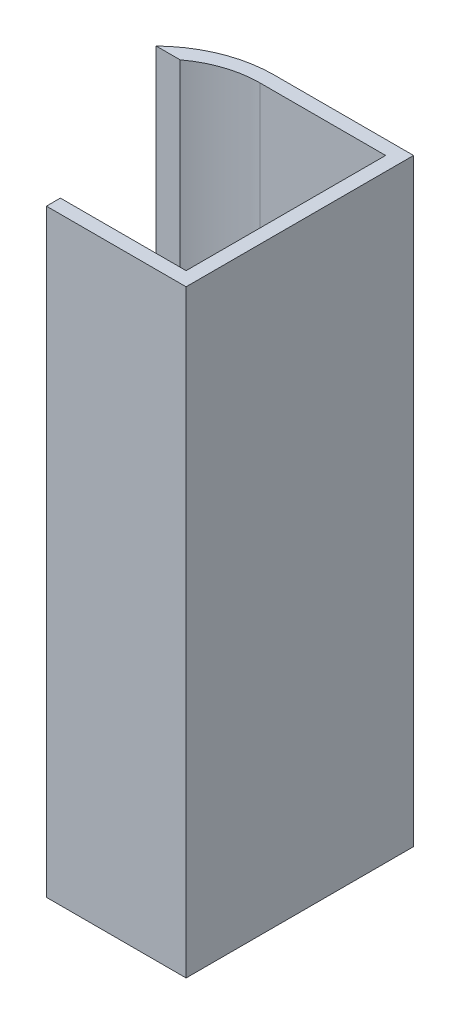
ISO-10303-21;
HEADER;
FILE_DESCRIPTION(('STEP AP214'),'2;1');
FILE_NAME('part.step','',(''),(''),'','','');
FILE_SCHEMA(('AUTOMOTIVE_DESIGN { 1 0 10303 214 1 1 1 1 }'));
ENDSEC;
DATA;
#1=APPLICATION_CONTEXT('core data for automotive mechanical design processes');
#2=APPLICATION_PROTOCOL_DEFINITION('international standard','automotive_design',2000,#1);
#3=PRODUCT_CONTEXT('',#1,'mechanical');
#4=PRODUCT('Part','Part','',(#3));
#5=PRODUCT_RELATED_PRODUCT_CATEGORY('part','',(#4));
#6=PRODUCT_DEFINITION_FORMATION('','',#4);
#7=PRODUCT_DEFINITION_CONTEXT('part definition',#1,'design');
#8=PRODUCT_DEFINITION('design','',#6,#7);
#9=PRODUCT_DEFINITION_SHAPE('','',#8);
#10=(LENGTH_UNIT() NAMED_UNIT(*) SI_UNIT(.MILLI.,.METRE.));
#11=(NAMED_UNIT(*) PLANE_ANGLE_UNIT() SI_UNIT($,.RADIAN.));
#12=(NAMED_UNIT(*) SI_UNIT($,.STERADIAN.) SOLID_ANGLE_UNIT());
#13=UNCERTAINTY_MEASURE_WITH_UNIT(LENGTH_MEASURE(1.E-05),#10,'distance_accuracy_value','');
#14=(GEOMETRIC_REPRESENTATION_CONTEXT(3) GLOBAL_UNCERTAINTY_ASSIGNED_CONTEXT((#13)) GLOBAL_UNIT_ASSIGNED_CONTEXT((#10,
#11,#12)) REPRESENTATION_CONTEXT('',''));
#15=CARTESIAN_POINT('',(0.,0.,0.));
#16=DIRECTION('',(0.,0.,1.));
#17=DIRECTION('',(1.,0.,0.));
#18=AXIS2_PLACEMENT_3D('',#15,#16,#17);
#19=CARTESIAN_POINT('',(6.99999999999999,300.,-57.));
#20=DIRECTION('',(0.,0.,1.));
#21=DIRECTION('',(1.,0.,0.));
#22=AXIS2_PLACEMENT_3D('',#19,#20,#21);
#23=PLANE('',#22);
#24=DIRECTION('',(-1.,0.,0.));
#25=VECTOR('',#24,1.);
#26=CARTESIAN_POINT('',(6.99999999999999,0.,-57.));
#27=LINE('',#26,#25);
#28=CARTESIAN_POINT('',(6.99999999999999,0.,-57.));
#29=VERTEX_POINT('',#28);
#30=CARTESIAN_POINT('',(-63.,0.,-57.));
#31=VERTEX_POINT('',#30);
#32=EDGE_CURVE('E141',#29,#31,#27,.T.);
#33=ORIENTED_EDGE('',*,*,#32,.T.);
#34=DIRECTION('',(0.,-1.,0.));
#35=VECTOR('',#34,1.);
#36=CARTESIAN_POINT('',(-63.,300.,-57.));
#37=LINE('',#36,#35);
#38=CARTESIAN_POINT('',(-63.,300.,-57.));
#39=VERTEX_POINT('',#38);
#40=EDGE_CURVE('E11',#39,#31,#37,.T.);
#41=ORIENTED_EDGE('',*,*,#40,.F.);
#42=DIRECTION('',(-1.,0.,0.));
#43=VECTOR('',#42,1.);
#44=CARTESIAN_POINT('',(6.99999999999999,300.,-57.));
#45=LINE('',#44,#43);
#46=CARTESIAN_POINT('',(6.99999999999999,300.,-57.));
#47=VERTEX_POINT('',#46);
#48=EDGE_CURVE('E159',#47,#39,#45,.T.);
#49=ORIENTED_EDGE('',*,*,#48,.F.);
#50=DIRECTION('',(0.,-1.,0.));
#51=VECTOR('',#50,1.);
#52=CARTESIAN_POINT('',(6.99999999999999,300.,-57.));
#53=LINE('',#52,#51);
#54=EDGE_CURVE('E137',#47,#29,#53,.T.);
#55=ORIENTED_EDGE('',*,*,#54,.T.);
#56=EDGE_LOOP('',(#33,#41,#49,#55));
#57=FACE_BOUND('',#56,.T.);
#58=ADVANCED_FACE('F33',(#57),#23,.F.);
#59=CARTESIAN_POINT('',(-63.,300.,3.38235294117649));
#60=DIRECTION('',(0.,-1.,0.));
#61=DIRECTION('',(0.,0.,-1.));
#62=AXIS2_PLACEMENT_3D('',#59,#60,#61);
#63=CYLINDRICAL_SURFACE('',#62,60.3823529411765);
#64=CARTESIAN_POINT('',(-63.,0.,3.38235294117649));
#65=DIRECTION('',(0.,1.,0.));
#66=DIRECTION('',(0.,0.,1.));
#67=AXIS2_PLACEMENT_3D('',#64,#65,#66);
#68=CIRCLE('',#67,60.3823529411765);
#69=CARTESIAN_POINT('',(-105.,0.,-40.));
#70=VERTEX_POINT('',#69);
#71=EDGE_CURVE('E144',#31,#70,#68,.T.);
#72=ORIENTED_EDGE('',*,*,#71,.T.);
#73=DIRECTION('',(0.,-1.,0.));
#74=VECTOR('',#73,1.);
#75=CARTESIAN_POINT('',(-105.,300.,-40.));
#76=LINE('',#75,#74);
#77=CARTESIAN_POINT('',(-105.,300.,-40.));
#78=VERTEX_POINT('',#77);
#79=EDGE_CURVE('E41',#78,#70,#76,.T.);
#80=ORIENTED_EDGE('',*,*,#79,.F.);
#81=CARTESIAN_POINT('',(-63.,300.,3.38235294117649));
#82=DIRECTION('',(0.,1.,0.));
#83=DIRECTION('',(0.,0.,1.));
#84=AXIS2_PLACEMENT_3D('',#81,#82,#83);
#85=CIRCLE('',#84,60.3823529411765);
#86=EDGE_CURVE('E98',#39,#78,#85,.T.);
#87=ORIENTED_EDGE('',*,*,#86,.F.);
#88=ORIENTED_EDGE('',*,*,#40,.T.);
#89=EDGE_LOOP('',(#72,#80,#87,#88));
#90=FACE_BOUND('',#89,.T.);
#91=ADVANCED_FACE('F208',(#90),#63,.T.);
#92=CARTESIAN_POINT('',(-105.,300.,-40.));
#93=DIRECTION('',(0.,0.,-1.));
#94=DIRECTION('',(-1.,0.,0.));
#95=AXIS2_PLACEMENT_3D('',#92,#93,#94);
#96=PLANE('',#95);
#97=DIRECTION('',(1.,0.,0.));
#98=VECTOR('',#97,1.);
#99=CARTESIAN_POINT('',(-105.,0.,-40.));
#100=LINE('',#99,#98);
#101=CARTESIAN_POINT('',(-93.,0.,-40.));
#102=VERTEX_POINT('',#101);
#103=EDGE_CURVE('E146',#70,#102,#100,.T.);
#104=ORIENTED_EDGE('',*,*,#103,.T.);
#105=DIRECTION('',(0.,-1.,0.));
#106=VECTOR('',#105,1.);
#107=CARTESIAN_POINT('',(-93.,300.,-40.));
#108=LINE('',#107,#106);
#109=CARTESIAN_POINT('',(-93.,300.,-40.));
#110=VERTEX_POINT('',#109);
#111=EDGE_CURVE('E172',#110,#102,#108,.T.);
#112=ORIENTED_EDGE('',*,*,#111,.F.);
#113=DIRECTION('',(1.,0.,0.));
#114=VECTOR('',#113,1.);
#115=CARTESIAN_POINT('',(-105.,300.,-40.));
#116=LINE('',#115,#114);
#117=EDGE_CURVE('E180',#78,#110,#116,.T.);
#118=ORIENTED_EDGE('',*,*,#117,.F.);
#119=ORIENTED_EDGE('',*,*,#79,.T.);
#120=EDGE_LOOP('',(#104,#112,#118,#119));
#121=FACE_BOUND('',#120,.T.);
#122=ADVANCED_FACE('F178',(#121),#96,.F.);
#123=CARTESIAN_POINT('',(-63.,300.,0.));
#124=DIRECTION('',(0.,-1.,0.));
#125=DIRECTION('',(0.,0.,-1.));
#126=AXIS2_PLACEMENT_3D('',#123,#124,#125);
#127=CYLINDRICAL_SURFACE('',#126,50.);
#128=CARTESIAN_POINT('',(-63.,0.,0.));
#129=DIRECTION('',(0.,-1.,0.));
#130=DIRECTION('',(0.,0.,-1.));
#131=AXIS2_PLACEMENT_3D('',#128,#129,#130);
#132=CIRCLE('',#131,50.);
#133=CARTESIAN_POINT('',(-63.,0.,-50.));
#134=VERTEX_POINT('',#133);
#135=EDGE_CURVE('E148',#102,#134,#132,.T.);
#136=ORIENTED_EDGE('',*,*,#135,.T.);
#137=DIRECTION('',(0.,-1.,0.));
#138=VECTOR('',#137,1.);
#139=CARTESIAN_POINT('',(-63.,300.,-50.));
#140=LINE('',#139,#138);
#141=CARTESIAN_POINT('',(-63.,300.,-50.));
#142=VERTEX_POINT('',#141);
#143=EDGE_CURVE('E169',#142,#134,#140,.T.);
#144=ORIENTED_EDGE('',*,*,#143,.F.);
#145=CARTESIAN_POINT('',(-63.,300.,0.));
#146=DIRECTION('',(0.,-1.,0.));
#147=DIRECTION('',(0.,0.,-1.));
#148=AXIS2_PLACEMENT_3D('',#145,#146,#147);
#149=CIRCLE('',#148,50.);
#150=EDGE_CURVE('E198',#110,#142,#149,.T.);
#151=ORIENTED_EDGE('',*,*,#150,.F.);
#152=ORIENTED_EDGE('',*,*,#111,.T.);
#153=EDGE_LOOP('',(#136,#144,#151,#152));
#154=FACE_BOUND('',#153,.T.);
#155=ADVANCED_FACE('F189',(#154),#127,.F.);
#156=CARTESIAN_POINT('',(-63.,300.,-50.));
#157=DIRECTION('',(0.,0.,-1.));
#158=DIRECTION('',(-1.,0.,0.));
#159=AXIS2_PLACEMENT_3D('',#156,#157,#158);
#160=PLANE('',#159);
#161=DIRECTION('',(1.,0.,0.));
#162=VECTOR('',#161,1.);
#163=CARTESIAN_POINT('',(-63.,0.,-50.));
#164=LINE('',#163,#162);
#165=CARTESIAN_POINT('',(0.,0.,-50.));
#166=VERTEX_POINT('',#165);
#167=EDGE_CURVE('E150',#134,#166,#164,.T.);
#168=ORIENTED_EDGE('',*,*,#167,.T.);
#169=DIRECTION('',(0.,-1.,0.));
#170=VECTOR('',#169,1.);
#171=CARTESIAN_POINT('',(0.,300.,-50.));
#172=LINE('',#171,#170);
#173=CARTESIAN_POINT('',(0.,300.,-50.));
#174=VERTEX_POINT('',#173);
#175=EDGE_CURVE('E166',#174,#166,#172,.T.);
#176=ORIENTED_EDGE('',*,*,#175,.F.);
#177=DIRECTION('',(1.,0.,0.));
#178=VECTOR('',#177,1.);
#179=CARTESIAN_POINT('',(-63.,300.,-50.));
#180=LINE('',#179,#178);
#181=EDGE_CURVE('E195',#142,#174,#180,.T.);
#182=ORIENTED_EDGE('',*,*,#181,.F.);
#183=ORIENTED_EDGE('',*,*,#143,.T.);
#184=EDGE_LOOP('',(#168,#176,#182,#183));
#185=FACE_BOUND('',#184,.T.);
#186=ADVANCED_FACE('F193',(#185),#160,.F.);
#187=CARTESIAN_POINT('',(0.,300.,-50.));
#188=DIRECTION('',(1.,0.,0.));
#189=DIRECTION('',(0.,0.,-1.));
#190=AXIS2_PLACEMENT_3D('',#187,#188,#189);
#191=PLANE('',#190);
#192=DIRECTION('',(0.,0.,1.));
#193=VECTOR('',#192,1.);
#194=CARTESIAN_POINT('',(0.,0.,-50.));
#195=LINE('',#194,#193);
#196=CARTESIAN_POINT('',(0.,0.,50.));
#197=VERTEX_POINT('',#196);
#198=EDGE_CURVE('E152',#166,#197,#195,.T.);
#199=ORIENTED_EDGE('',*,*,#198,.T.);
#200=DIRECTION('',(0.,-1.,0.));
#201=VECTOR('',#200,1.);
#202=CARTESIAN_POINT('',(0.,300.,50.));
#203=LINE('',#202,#201);
#204=CARTESIAN_POINT('',(0.,300.,50.));
#205=VERTEX_POINT('',#204);
#206=EDGE_CURVE('E163',#205,#197,#203,.T.);
#207=ORIENTED_EDGE('',*,*,#206,.F.);
#208=DIRECTION('',(0.,0.,1.));
#209=VECTOR('',#208,1.);
#210=CARTESIAN_POINT('',(0.,300.,-50.));
#211=LINE('',#210,#209);
#212=EDGE_CURVE('E197',#174,#205,#211,.T.);
#213=ORIENTED_EDGE('',*,*,#212,.F.);
#214=ORIENTED_EDGE('',*,*,#175,.T.);
#215=EDGE_LOOP('',(#199,#207,#213,#214));
#216=FACE_BOUND('',#215,.T.);
#217=ADVANCED_FACE('F220',(#216),#191,.F.);
#218=CARTESIAN_POINT('',(0.,300.,50.));
#219=DIRECTION('',(0.,0.,1.));
#220=DIRECTION('',(1.,0.,0.));
#221=AXIS2_PLACEMENT_3D('',#218,#219,#220);
#222=PLANE('',#221);
#223=DIRECTION('',(-1.,0.,0.));
#224=VECTOR('',#223,1.);
#225=CARTESIAN_POINT('',(0.,0.,50.));
#226=LINE('',#225,#224);
#227=CARTESIAN_POINT('',(-63.,0.,50.));
#228=VERTEX_POINT('',#227);
#229=EDGE_CURVE('E154',#197,#228,#226,.T.);
#230=ORIENTED_EDGE('',*,*,#229,.T.);
#231=DIRECTION('',(0.,-1.,0.));
#232=VECTOR('',#231,1.);
#233=CARTESIAN_POINT('',(-63.,300.,50.));
#234=LINE('',#233,#232);
#235=CARTESIAN_POINT('',(-63.,300.,50.));
#236=VERTEX_POINT('',#235);
#237=EDGE_CURVE('E132',#236,#228,#234,.T.);
#238=ORIENTED_EDGE('',*,*,#237,.F.);
#239=DIRECTION('',(-1.,0.,0.));
#240=VECTOR('',#239,1.);
#241=CARTESIAN_POINT('',(0.,300.,50.));
#242=LINE('',#241,#240);
#243=EDGE_CURVE('E123',#205,#236,#242,.T.);
#244=ORIENTED_EDGE('',*,*,#243,.F.);
#245=ORIENTED_EDGE('',*,*,#206,.T.);
#246=EDGE_LOOP('',(#230,#238,#244,#245));
#247=FACE_BOUND('',#246,.T.);
#248=ADVANCED_FACE('F223',(#247),#222,.F.);
#249=CARTESIAN_POINT('',(-63.,300.,57.));
#250=DIRECTION('',(1.,0.,0.));
#251=DIRECTION('',(0.,0.,-1.));
#252=AXIS2_PLACEMENT_3D('',#249,#250,#251);
#253=PLANE('',#252);
#254=DIRECTION('',(0.,0.,1.));
#255=VECTOR('',#254,1.);
#256=CARTESIAN_POINT('',(-63.,0.,57.));
#257=LINE('',#256,#255);
#258=CARTESIAN_POINT('',(-63.,0.,57.));
#259=VERTEX_POINT('',#258);
#260=EDGE_CURVE('E131',#228,#259,#257,.T.);
#261=ORIENTED_EDGE('',*,*,#260,.T.);
#262=DIRECTION('',(0.,-1.,0.));
#263=VECTOR('',#262,1.);
#264=CARTESIAN_POINT('',(-63.,300.,57.));
#265=LINE('',#264,#263);
#266=CARTESIAN_POINT('',(-63.,300.,57.));
#267=VERTEX_POINT('',#266);
#268=EDGE_CURVE('E128',#267,#259,#265,.T.);
#269=ORIENTED_EDGE('',*,*,#268,.F.);
#270=DIRECTION('',(0.,0.,1.));
#271=VECTOR('',#270,1.);
#272=CARTESIAN_POINT('',(-63.,300.,57.));
#273=LINE('',#272,#271);
#274=EDGE_CURVE('E117',#236,#267,#273,.T.);
#275=ORIENTED_EDGE('',*,*,#274,.F.);
#276=ORIENTED_EDGE('',*,*,#237,.T.);
#277=EDGE_LOOP('',(#261,#269,#275,#276));
#278=FACE_BOUND('',#277,.T.);
#279=ADVANCED_FACE('F129',(#278),#253,.F.);
#280=CARTESIAN_POINT('',(7.00000000000001,300.,57.));
#281=DIRECTION('',(0.,0.,-1.));
#282=DIRECTION('',(-1.,0.,0.));
#283=AXIS2_PLACEMENT_3D('',#280,#281,#282);
#284=PLANE('',#283);
#285=DIRECTION('',(1.,0.,0.));
#286=VECTOR('',#285,1.);
#287=CARTESIAN_POINT('',(7.00000000000001,0.,57.));
#288=LINE('',#287,#286);
#289=CARTESIAN_POINT('',(7.00000000000001,0.,57.));
#290=VERTEX_POINT('',#289);
#291=EDGE_CURVE('E84',#259,#290,#288,.T.);
#292=ORIENTED_EDGE('',*,*,#291,.T.);
#293=DIRECTION('',(0.,-1.,0.));
#294=VECTOR('',#293,1.);
#295=CARTESIAN_POINT('',(7.00000000000001,300.,57.));
#296=LINE('',#295,#294);
#297=CARTESIAN_POINT('',(7.00000000000001,300.,57.));
#298=VERTEX_POINT('',#297);
#299=EDGE_CURVE('E133',#298,#290,#296,.T.);
#300=ORIENTED_EDGE('',*,*,#299,.F.);
#301=DIRECTION('',(1.,0.,0.));
#302=VECTOR('',#301,1.);
#303=CARTESIAN_POINT('',(7.00000000000001,300.,57.));
#304=LINE('',#303,#302);
#305=EDGE_CURVE('E121',#267,#298,#304,.T.);
#306=ORIENTED_EDGE('',*,*,#305,.F.);
#307=ORIENTED_EDGE('',*,*,#268,.T.);
#308=EDGE_LOOP('',(#292,#300,#306,#307));
#309=FACE_BOUND('',#308,.T.);
#310=ADVANCED_FACE('F135',(#309),#284,.F.);
#311=CARTESIAN_POINT('',(6.99999999999999,300.,-57.));
#312=DIRECTION('',(-1.,0.,0.));
#313=DIRECTION('',(0.,0.,1.));
#314=AXIS2_PLACEMENT_3D('',#311,#312,#313);
#315=PLANE('',#314);
#316=DIRECTION('',(0.,0.,-1.));
#317=VECTOR('',#316,1.);
#318=CARTESIAN_POINT('',(6.99999999999999,0.,-57.));
#319=LINE('',#318,#317);
#320=EDGE_CURVE('E90',#290,#29,#319,.T.);
#321=ORIENTED_EDGE('',*,*,#320,.T.);
#322=ORIENTED_EDGE('',*,*,#54,.F.);
#323=DIRECTION('',(0.,0.,-1.));
#324=VECTOR('',#323,1.);
#325=CARTESIAN_POINT('',(6.99999999999999,300.,-57.));
#326=LINE('',#325,#324);
#327=EDGE_CURVE('E49',#298,#47,#326,.T.);
#328=ORIENTED_EDGE('',*,*,#327,.F.);
#329=ORIENTED_EDGE('',*,*,#299,.T.);
#330=EDGE_LOOP('',(#321,#322,#328,#329));
#331=FACE_BOUND('',#330,.T.);
#332=ADVANCED_FACE('F232',(#331),#315,.F.);
#333=CARTESIAN_POINT('',(-63.,300.,3.38235294117649));
#334=DIRECTION('',(0.,1.,0.));
#335=DIRECTION('',(0.,0.,1.));
#336=AXIS2_PLACEMENT_3D('',#333,#334,#335);
#337=PLANE('',#336);
#338=ORIENTED_EDGE('',*,*,#48,.T.);
#339=ORIENTED_EDGE('',*,*,#86,.T.);
#340=ORIENTED_EDGE('',*,*,#117,.T.);
#341=ORIENTED_EDGE('',*,*,#150,.T.);
#342=ORIENTED_EDGE('',*,*,#181,.T.);
#343=ORIENTED_EDGE('',*,*,#212,.T.);
#344=ORIENTED_EDGE('',*,*,#243,.T.);
#345=ORIENTED_EDGE('',*,*,#274,.T.);
#346=ORIENTED_EDGE('',*,*,#305,.T.);
#347=ORIENTED_EDGE('',*,*,#327,.T.);
#348=EDGE_LOOP('',(#338,#339,#340,#341,#342,#343,#344,#345,#346,#347));
#349=FACE_BOUND('',#348,.T.);
#350=ADVANCED_FACE('F119',(#349),#337,.T.);
#351=CARTESIAN_POINT('',(-63.,0.,3.38235294117649));
#352=DIRECTION('',(0.,1.,0.));
#353=DIRECTION('',(0.,0.,1.));
#354=AXIS2_PLACEMENT_3D('',#351,#352,#353);
#355=PLANE('',#354);
#356=ORIENTED_EDGE('',*,*,#32,.F.);
#357=ORIENTED_EDGE('',*,*,#320,.F.);
#358=ORIENTED_EDGE('',*,*,#291,.F.);
#359=ORIENTED_EDGE('',*,*,#260,.F.);
#360=ORIENTED_EDGE('',*,*,#229,.F.);
#361=ORIENTED_EDGE('',*,*,#198,.F.);
#362=ORIENTED_EDGE('',*,*,#167,.F.);
#363=ORIENTED_EDGE('',*,*,#135,.F.);
#364=ORIENTED_EDGE('',*,*,#103,.F.);
#365=ORIENTED_EDGE('',*,*,#71,.F.);
#366=EDGE_LOOP('',(#356,#357,#358,#359,#360,#361,#362,#363,#364,#365));
#367=FACE_BOUND('',#366,.T.);
#368=ADVANCED_FACE('F184',(#367),#355,.F.);
#369=CLOSED_SHELL('',(#58,#91,#122,#155,#186,#217,#248,#279,#310,#332,#350,#368));
#370=MANIFOLD_SOLID_BREP('B2',#369);
#371=ADVANCED_BREP_SHAPE_REPRESENTATION('',(#18,#370),#14);
#372=SHAPE_DEFINITION_REPRESENTATION(#9,#371);
ENDSEC;
END-ISO-10303-21;
